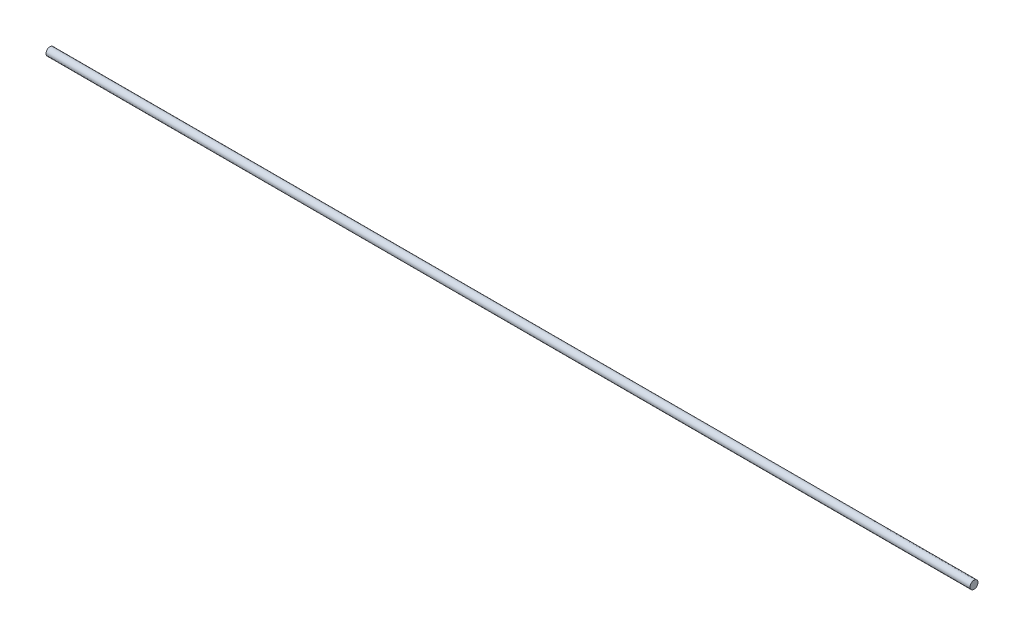
ISO-10303-21;
HEADER;
FILE_DESCRIPTION(('STEP AP214'),'2;1');
FILE_NAME('part.step','',(''),(''),'','','');
FILE_SCHEMA(('AUTOMOTIVE_DESIGN { 1 0 10303 214 1 1 1 1 }'));
ENDSEC;
DATA;
#1=APPLICATION_CONTEXT('core data for automotive mechanical design processes');
#2=APPLICATION_PROTOCOL_DEFINITION('international standard','automotive_design',2000,#1);
#3=PRODUCT_CONTEXT('',#1,'mechanical');
#4=PRODUCT('Part','Part','',(#3));
#5=PRODUCT_RELATED_PRODUCT_CATEGORY('part','',(#4));
#6=PRODUCT_DEFINITION_FORMATION('','',#4);
#7=PRODUCT_DEFINITION_CONTEXT('part definition',#1,'design');
#8=PRODUCT_DEFINITION('design','',#6,#7);
#9=PRODUCT_DEFINITION_SHAPE('','',#8);
#10=(LENGTH_UNIT() NAMED_UNIT(*) SI_UNIT(.MILLI.,.METRE.));
#11=(NAMED_UNIT(*) PLANE_ANGLE_UNIT() SI_UNIT($,.RADIAN.));
#12=(NAMED_UNIT(*) SI_UNIT($,.STERADIAN.) SOLID_ANGLE_UNIT());
#13=UNCERTAINTY_MEASURE_WITH_UNIT(LENGTH_MEASURE(1.E-05),#10,'distance_accuracy_value','');
#14=(GEOMETRIC_REPRESENTATION_CONTEXT(3) GLOBAL_UNCERTAINTY_ASSIGNED_CONTEXT((#13)) GLOBAL_UNIT_ASSIGNED_CONTEXT((#10,
#11,#12)) REPRESENTATION_CONTEXT('',''));
#15=CARTESIAN_POINT('',(0.,0.,0.));
#16=DIRECTION('',(0.,0.,1.));
#17=DIRECTION('',(1.,0.,0.));
#18=AXIS2_PLACEMENT_3D('',#15,#16,#17);
#19=CARTESIAN_POINT('',(812.8,0.,0.));
#20=DIRECTION('',(-1.,0.,0.));
#21=DIRECTION('',(0.,0.,1.));
#22=AXIS2_PLACEMENT_3D('',#19,#20,#21);
#23=CYLINDRICAL_SURFACE('',#22,3.5);
#24=CARTESIAN_POINT('',(812.8,0.,0.));
#25=DIRECTION('',(1.,0.,0.));
#26=DIRECTION('',(0.,0.,-1.));
#27=AXIS2_PLACEMENT_3D('',#24,#25,#26);
#28=CIRCLE('',#27,3.5);
#29=CARTESIAN_POINT('',(812.8,0.,-3.5));
#30=VERTEX_POINT('',#29);
#31=EDGE_CURVE('E10',#30,#30,#28,.T.);
#32=ORIENTED_EDGE('',*,*,#31,.F.);
#33=EDGE_LOOP('',(#32));
#34=FACE_BOUND('',#33,.T.);
#35=CARTESIAN_POINT('',(0.,0.,0.));
#36=DIRECTION('',(1.,0.,0.));
#37=DIRECTION('',(0.,0.,-1.));
#38=AXIS2_PLACEMENT_3D('',#35,#36,#37);
#39=CIRCLE('',#38,3.5);
#40=CARTESIAN_POINT('',(0.,0.,-3.5));
#41=VERTEX_POINT('',#40);
#42=EDGE_CURVE('E34',#41,#41,#39,.T.);
#43=ORIENTED_EDGE('',*,*,#42,.T.);
#44=EDGE_LOOP('',(#43));
#45=FACE_BOUND('',#44,.T.);
#46=ADVANCED_FACE('F31',(#34,#45),#23,.T.);
#47=CARTESIAN_POINT('',(812.8,0.,0.));
#48=DIRECTION('',(1.,0.,0.));
#49=DIRECTION('',(0.,0.,-1.));
#50=AXIS2_PLACEMENT_3D('',#47,#48,#49);
#51=PLANE('',#50);
#52=ORIENTED_EDGE('',*,*,#31,.T.);
#53=EDGE_LOOP('',(#52));
#54=FACE_BOUND('',#53,.T.);
#55=ADVANCED_FACE('F46',(#54),#51,.T.);
#56=CARTESIAN_POINT('',(0.,0.,0.));
#57=DIRECTION('',(1.,0.,0.));
#58=DIRECTION('',(0.,0.,-1.));
#59=AXIS2_PLACEMENT_3D('',#56,#57,#58);
#60=PLANE('',#59);
#61=ORIENTED_EDGE('',*,*,#42,.F.);
#62=EDGE_LOOP('',(#61));
#63=FACE_BOUND('',#62,.T.);
#64=ADVANCED_FACE('F44',(#63),#60,.F.);
#65=CLOSED_SHELL('',(#46,#55,#64));
#66=MANIFOLD_SOLID_BREP('B2',#65);
#67=ADVANCED_BREP_SHAPE_REPRESENTATION('',(#18,#66),#14);
#68=SHAPE_DEFINITION_REPRESENTATION(#9,#67);
ENDSEC;
END-ISO-10303-21;
